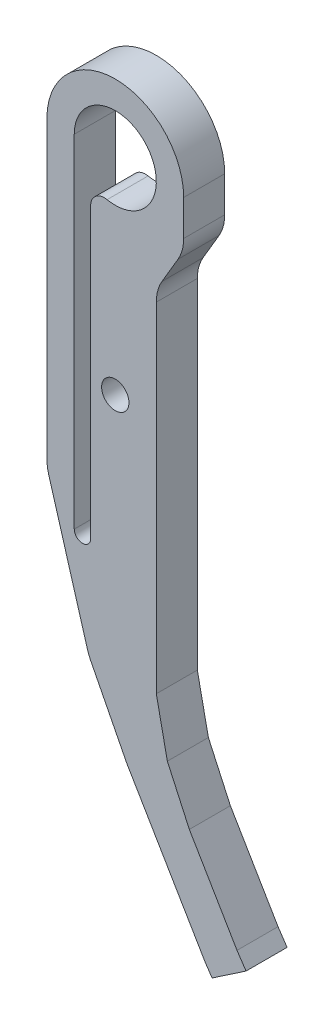
ISO-10303-21;
HEADER;
FILE_DESCRIPTION(('STEP AP214'),'2;1');
FILE_NAME('part.step','',(''),(''),'','','');
FILE_SCHEMA(('AUTOMOTIVE_DESIGN { 1 0 10303 214 1 1 1 1 }'));
ENDSEC;
DATA;
#1=APPLICATION_CONTEXT('core data for automotive mechanical design processes');
#2=APPLICATION_PROTOCOL_DEFINITION('international standard','automotive_design',2000,#1);
#3=PRODUCT_CONTEXT('',#1,'mechanical');
#4=PRODUCT('Part','Part','',(#3));
#5=PRODUCT_RELATED_PRODUCT_CATEGORY('part','',(#4));
#6=PRODUCT_DEFINITION_FORMATION('','',#4);
#7=PRODUCT_DEFINITION_CONTEXT('part definition',#1,'design');
#8=PRODUCT_DEFINITION('design','',#6,#7);
#9=PRODUCT_DEFINITION_SHAPE('','',#8);
#10=(LENGTH_UNIT() NAMED_UNIT(*) SI_UNIT(.MILLI.,.METRE.));
#11=(NAMED_UNIT(*) PLANE_ANGLE_UNIT() SI_UNIT($,.RADIAN.));
#12=(NAMED_UNIT(*) SI_UNIT($,.STERADIAN.) SOLID_ANGLE_UNIT());
#13=UNCERTAINTY_MEASURE_WITH_UNIT(LENGTH_MEASURE(1.E-05),#10,'distance_accuracy_value','');
#14=(GEOMETRIC_REPRESENTATION_CONTEXT(3) GLOBAL_UNCERTAINTY_ASSIGNED_CONTEXT((#13)) GLOBAL_UNIT_ASSIGNED_CONTEXT((#10,
#11,#12)) REPRESENTATION_CONTEXT('',''));
#15=CARTESIAN_POINT('',(0.,0.,0.));
#16=DIRECTION('',(0.,0.,1.));
#17=DIRECTION('',(1.,0.,0.));
#18=AXIS2_PLACEMENT_3D('',#15,#16,#17);
#19=CARTESIAN_POINT('',(0.,0.,3.));
#20=DIRECTION('',(0.,0.,1.));
#21=DIRECTION('',(1.,0.,0.));
#22=AXIS2_PLACEMENT_3D('',#19,#20,#21);
#23=PLANE('',#22);
#24=CARTESIAN_POINT('',(0.,0.,3.));
#25=DIRECTION('',(0.,0.,1.));
#26=DIRECTION('',(1.,0.,0.));
#27=AXIS2_PLACEMENT_3D('',#24,#25,#26);
#28=CIRCLE('',#27,4.99999999999989);
#29=CARTESIAN_POINT('',(4.99999999999989,0.,3.));
#30=VERTEX_POINT('',#29);
#31=CARTESIAN_POINT('',(-4.99999999999989,0.,3.));
#32=VERTEX_POINT('',#31);
#33=EDGE_CURVE('E246',#30,#32,#28,.T.);
#34=ORIENTED_EDGE('',*,*,#33,.T.);
#35=DIRECTION('',(0.,-1.,0.));
#36=VECTOR('',#35,1.);
#37=CARTESIAN_POINT('',(-4.99999999999989,-21.5350638762466,3.));
#38=LINE('',#37,#36);
#39=CARTESIAN_POINT('',(-5.00000000000001,-21.5350638762466,3.));
#40=VERTEX_POINT('',#39);
#41=EDGE_CURVE('E249',#32,#40,#38,.T.);
#42=ORIENTED_EDGE('',*,*,#41,.T.);
#43=CARTESIAN_POINT('',(-1.50000000000006,-21.5350638762466,3.));
#44=DIRECTION('',(0.,0.,1.));
#45=DIRECTION('',(1.,0.,0.));
#46=AXIS2_PLACEMENT_3D('',#43,#44,#45);
#47=CIRCLE('',#46,3.49999999999995);
#48=CARTESIAN_POINT('',(-4.8579069316852,-22.5222118074815,3.));
#49=VERTEX_POINT('',#48);
#50=EDGE_CURVE('E252',#40,#49,#47,.T.);
#51=ORIENTED_EDGE('',*,*,#50,.T.);
#52=DIRECTION('',(0.282042266067126,-0.959401980481446,0.));
#53=VECTOR('',#52,1.);
#54=CARTESIAN_POINT('',(-2.03270186247329,-32.1324995720218,3.));
#55=LINE('',#54,#53);
#56=CARTESIAN_POINT('',(-2.03270186247341,-32.1324995720218,3.));
#57=VERTEX_POINT('',#56);
#58=EDGE_CURVE('E254',#49,#57,#55,.T.);
#59=ORIENTED_EDGE('',*,*,#58,.T.);
#60=CARTESIAN_POINT('',(1.32520506921185,-31.1453516407869,3.));
#61=DIRECTION('',(0.,0.,1.));
#62=DIRECTION('',(1.,0.,0.));
#63=AXIS2_PLACEMENT_3D('',#60,#61,#62);
#64=CIRCLE('',#63,3.50000000000019);
#65=CARTESIAN_POINT('',(-1.79409652727758,-32.7327890569205,3.));
#66=VERTEX_POINT('',#65);
#67=EDGE_CURVE('E256',#57,#66,#64,.T.);
#68=ORIENTED_EDGE('',*,*,#67,.T.);
#69=DIRECTION('',(0.453553547466907,-0.891229027568214,0.));
#70=VECTOR('',#69,1.);
#71=CARTESIAN_POINT('',(0.79125555035775,-37.8129848374209,3.));
#72=LINE('',#71,#70);
#73=CARTESIAN_POINT('',(0.791255550357943,-37.8129848374208,3.));
#74=VERTEX_POINT('',#73);
#75=EDGE_CURVE('E258',#66,#74,#72,.T.);
#76=ORIENTED_EDGE('',*,*,#75,.T.);
#77=CARTESIAN_POINT('',(3.4649426330625,-36.4523241950203,3.));
#78=DIRECTION('',(0.,0.,1.));
#79=DIRECTION('',(1.,0.,0.));
#80=AXIS2_PLACEMENT_3D('',#77,#78,#79);
#81=CIRCLE('',#80,2.99999999999985);
#82=CARTESIAN_POINT('',(0.880089763503982,-37.9749980414933,3.));
#83=VERTEX_POINT('',#82);
#84=EDGE_CURVE('E260',#74,#83,#81,.T.);
#85=ORIENTED_EDGE('',*,*,#84,.T.);
#86=DIRECTION('',(0.50755794882443,-0.861617623186259,0.));
#87=VECTOR('',#86,1.);
#88=CARTESIAN_POINT('',(6.56573456522638,-47.626805823615,3.));
#89=LINE('',#88,#87);
#90=CARTESIAN_POINT('',(6.56573456522638,-47.626805823615,3.));
#91=VERTEX_POINT('',#90);
#92=EDGE_CURVE('E262',#83,#91,#89,.T.);
#93=ORIENTED_EDGE('',*,*,#92,.T.);
#94=DIRECTION('',(0.560410760909652,-0.828214814560006,0.));
#95=VECTOR('',#94,1.);
#96=CARTESIAN_POINT('',(7.077963412532,-48.3838139850837,3.));
#97=LINE('',#96,#95);
#98=CARTESIAN_POINT('',(7.077963412532,-48.3838139850837,3.));
#99=VERTEX_POINT('',#98);
#100=EDGE_CURVE('E264',#91,#99,#97,.T.);
#101=ORIENTED_EDGE('',*,*,#100,.T.);
#102=DIRECTION('',(0.82821481455998,0.56041076090969,0.));
#103=VECTOR('',#102,1.);
#104=CARTESIAN_POINT('',(9.56260785621144,-46.702581702355,3.));
#105=LINE('',#104,#103);
#106=CARTESIAN_POINT('',(9.56260785621144,-46.702581702355,3.));
#107=VERTEX_POINT('',#106);
#108=EDGE_CURVE('E266',#99,#107,#105,.T.);
#109=ORIENTED_EDGE('',*,*,#108,.T.);
#110=DIRECTION('',(-0.560410760910036,0.828214814559746,0.));
#111=VECTOR('',#110,1.);
#112=CARTESIAN_POINT('',(8.89976186397353,-45.7229808295032,3.));
#113=LINE('',#112,#111);
#114=CARTESIAN_POINT('',(8.89976186397353,-45.7229808295032,3.));
#115=VERTEX_POINT('',#114);
#116=EDGE_CURVE('E268',#107,#115,#113,.T.);
#117=ORIENTED_EDGE('',*,*,#116,.T.);
#118=DIRECTION('',(-0.507557948824447,0.861617623186248,0.));
#119=VECTOR('',#118,1.);
#120=CARTESIAN_POINT('',(5.41514713044074,-39.8075863974385,3.));
#121=LINE('',#120,#119);
#122=CARTESIAN_POINT('',(5.41514713044074,-39.8075863974385,3.));
#123=VERTEX_POINT('',#122);
#124=EDGE_CURVE('E270',#115,#123,#121,.T.);
#125=ORIENTED_EDGE('',*,*,#124,.T.);
#126=DIRECTION('',(-0.415986559571773,0.909370761711437,0.));
#127=VECTOR('',#126,1.);
#128=CARTESIAN_POINT('',(3.80711010811592,-36.2923241414728,3.));
#129=LINE('',#128,#127);
#130=CARTESIAN_POINT('',(3.80711010811592,-36.2923241414728,3.));
#131=VERTEX_POINT('',#130);
#132=EDGE_CURVE('E272',#123,#131,#129,.T.);
#133=ORIENTED_EDGE('',*,*,#132,.T.);
#134=DIRECTION('',(-0.204414432860834,0.978884436303992,0.));
#135=VECTOR('',#134,1.);
#136=CARTESIAN_POINT('',(2.99999999999952,-32.4272960602283,3.));
#137=LINE('',#136,#135);
#138=CARTESIAN_POINT('',(2.99999999999952,-32.4272960602283,3.));
#139=VERTEX_POINT('',#138);
#140=EDGE_CURVE('E274',#131,#139,#137,.T.);
#141=ORIENTED_EDGE('',*,*,#140,.T.);
#142=DIRECTION('',(0.,1.,0.));
#143=VECTOR('',#142,1.);
#144=CARTESIAN_POINT('',(2.99999999999952,-7.62938426557325,3.));
#145=LINE('',#144,#143);
#146=CARTESIAN_POINT('',(2.9999999999996,-7.62938426557325,3.));
#147=VERTEX_POINT('',#146);
#148=EDGE_CURVE('E276',#139,#147,#145,.T.);
#149=ORIENTED_EDGE('',*,*,#148,.T.);
#150=CARTESIAN_POINT('',(5.99999999999978,-7.62938426557325,3.));
#151=DIRECTION('',(0.,0.,-1.));
#152=DIRECTION('',(1.,0.,0.));
#153=AXIS2_PLACEMENT_3D('',#150,#151,#152);
#154=CIRCLE('',#153,3.00000000000018);
#155=CARTESIAN_POINT('',(3.41520528906081,-6.10661169479898,3.));
#156=VERTEX_POINT('',#155);
#157=EDGE_CURVE('E278',#147,#156,#154,.T.);
#158=ORIENTED_EDGE('',*,*,#157,.T.);
#159=DIRECTION('',(0.507590856924762,0.861598236979618,0.));
#160=VECTOR('',#159,1.);
#161=CARTESIAN_POINT('',(4.58479471093876,-4.12131946557071,3.));
#162=LINE('',#161,#160);
#163=CARTESIAN_POINT('',(4.58479471093867,-4.12131946557065,3.));
#164=VERTEX_POINT('',#163);
#165=EDGE_CURVE('E280',#156,#164,#162,.T.);
#166=ORIENTED_EDGE('',*,*,#165,.T.);
#167=CARTESIAN_POINT('',(1.99999999999978,-2.59854689479599,3.));
#168=DIRECTION('',(0.,0.,1.));
#169=DIRECTION('',(1.,0.,0.));
#170=AXIS2_PLACEMENT_3D('',#167,#168,#169);
#171=CIRCLE('',#170,3.00000000000022);
#172=CARTESIAN_POINT('',(4.99999999999989,-2.59854689479599,3.));
#173=VERTEX_POINT('',#172);
#174=EDGE_CURVE('E282',#164,#173,#171,.T.);
#175=ORIENTED_EDGE('',*,*,#174,.T.);
#176=DIRECTION('',(0.,1.,0.));
#177=VECTOR('',#176,1.);
#178=CARTESIAN_POINT('',(4.99999999999989,0.,3.));
#179=LINE('',#178,#177);
#180=EDGE_CURVE('E284',#173,#30,#179,.T.);
#181=ORIENTED_EDGE('',*,*,#180,.T.);
#182=EDGE_LOOP('',(#34,#42,#51,#59,#68,#76,#85,#93,#101,#109,#117,#125,#133,#141,#149,#158,#166,
#175,#181));
#183=FACE_BOUND('',#182,.T.);
#184=CARTESIAN_POINT('',(0.,-14.9999999999968,3.));
#185=DIRECTION('',(0.,0.,1.));
#186=DIRECTION('',(1.,0.,0.));
#187=AXIS2_PLACEMENT_3D('',#184,#185,#186);
#188=CIRCLE('',#187,0.99999999999989);
#189=CARTESIAN_POINT('',(0.99999999999989,-14.9999999999968,3.));
#190=VERTEX_POINT('',#189);
#191=EDGE_CURVE('E240',#190,#190,#188,.T.);
#192=ORIENTED_EDGE('',*,*,#191,.F.);
#193=EDGE_LOOP('',(#192));
#194=FACE_BOUND('',#193,.T.);
#195=CARTESIAN_POINT('',(0.,0.,3.));
#196=DIRECTION('',(0.,0.,1.));
#197=DIRECTION('',(1.,0.,0.));
#198=AXIS2_PLACEMENT_3D('',#195,#196,#197);
#199=CIRCLE('',#198,3.00000000000007);
#200=CARTESIAN_POINT('',(-0.599999999999498,-2.93938769133999,3.));
#201=VERTEX_POINT('',#200);
#202=CARTESIAN_POINT('',(-3.00000000000007,0.,3.));
#203=VERTEX_POINT('',#202);
#204=EDGE_CURVE('E204',#201,#203,#199,.T.);
#205=ORIENTED_EDGE('',*,*,#204,.F.);
#206=CARTESIAN_POINT('',(-0.800000000000356,-3.91918358845311,3.));
#207=DIRECTION('',(0.,0.,-1.));
#208=DIRECTION('',(1.,0.,0.));
#209=AXIS2_PLACEMENT_3D('',#206,#207,#208);
#210=CIRCLE('',#209,0.99999999999998);
#211=CARTESIAN_POINT('',(-1.80000000000025,-3.91918358845311,3.));
#212=VERTEX_POINT('',#211);
#213=EDGE_CURVE('E196',#212,#201,#210,.T.);
#214=ORIENTED_EDGE('',*,*,#213,.F.);
#215=DIRECTION('',(0.,1.,0.));
#216=VECTOR('',#215,1.);
#217=CARTESIAN_POINT('',(-1.80000000000025,-3.91918358845311,3.));
#218=LINE('',#217,#216);
#219=CARTESIAN_POINT('',(-1.80000000000025,-24.9999999999999,3.));
#220=VERTEX_POINT('',#219);
#221=EDGE_CURVE('E223',#220,#212,#218,.T.);
#222=ORIENTED_EDGE('',*,*,#221,.F.);
#223=CARTESIAN_POINT('',(-2.40000000000018,-24.9999999999999,3.));
#224=DIRECTION('',(0.,0.,1.));
#225=DIRECTION('',(1.,0.,0.));
#226=AXIS2_PLACEMENT_3D('',#223,#224,#225);
#227=CIRCLE('',#226,0.599999999999934);
#228=CARTESIAN_POINT('',(-3.00000000000011,-24.9999999999999,3.));
#229=VERTEX_POINT('',#228);
#230=EDGE_CURVE('E219',#229,#220,#227,.T.);
#231=ORIENTED_EDGE('',*,*,#230,.F.);
#232=DIRECTION('',(0.,-1.,0.));
#233=VECTOR('',#232,1.);
#234=CARTESIAN_POINT('',(-3.00000000000011,-24.9999999999999,3.));
#235=LINE('',#234,#233);
#236=EDGE_CURVE('E217',#203,#229,#235,.T.);
#237=ORIENTED_EDGE('',*,*,#236,.F.);
#238=EDGE_LOOP('',(#205,#214,#222,#231,#237));
#239=FACE_BOUND('',#238,.T.);
#240=ADVANCED_FACE('F35',(#183,#194,#239),#23,.T.);
#241=CARTESIAN_POINT('',(0.,0.,0.));
#242=DIRECTION('',(0.,0.,1.));
#243=DIRECTION('',(1.,0.,0.));
#244=AXIS2_PLACEMENT_3D('',#241,#242,#243);
#245=PLANE('',#244);
#246=CARTESIAN_POINT('',(0.,-14.9999999999968,0.));
#247=DIRECTION('',(0.,0.,1.));
#248=DIRECTION('',(1.,0.,0.));
#249=AXIS2_PLACEMENT_3D('',#246,#247,#248);
#250=CIRCLE('',#249,0.99999999999989);
#251=CARTESIAN_POINT('',(0.99999999999989,-14.9999999999968,0.));
#252=VERTEX_POINT('',#251);
#253=EDGE_CURVE('E212',#252,#252,#250,.T.);
#254=ORIENTED_EDGE('',*,*,#253,.T.);
#255=EDGE_LOOP('',(#254));
#256=FACE_BOUND('',#255,.T.);
#257=CARTESIAN_POINT('',(0.,0.,0.));
#258=DIRECTION('',(0.,0.,1.));
#259=DIRECTION('',(1.,0.,0.));
#260=AXIS2_PLACEMENT_3D('',#257,#258,#259);
#261=CIRCLE('',#260,4.99999999999989);
#262=CARTESIAN_POINT('',(4.99999999999989,0.,0.));
#263=VERTEX_POINT('',#262);
#264=CARTESIAN_POINT('',(-4.99999999999989,0.,0.));
#265=VERTEX_POINT('',#264);
#266=EDGE_CURVE('E243',#263,#265,#261,.T.);
#267=ORIENTED_EDGE('',*,*,#266,.F.);
#268=DIRECTION('',(0.,1.,0.));
#269=VECTOR('',#268,1.);
#270=CARTESIAN_POINT('',(4.99999999999989,0.,0.));
#271=LINE('',#270,#269);
#272=CARTESIAN_POINT('',(4.99999999999989,-2.59854689479599,0.));
#273=VERTEX_POINT('',#272);
#274=EDGE_CURVE('E250',#273,#263,#271,.T.);
#275=ORIENTED_EDGE('',*,*,#274,.F.);
#276=CARTESIAN_POINT('',(1.99999999999978,-2.59854689479599,0.));
#277=DIRECTION('',(0.,0.,1.));
#278=DIRECTION('',(1.,0.,0.));
#279=AXIS2_PLACEMENT_3D('',#276,#277,#278);
#280=CIRCLE('',#279,3.00000000000022);
#281=CARTESIAN_POINT('',(4.58479471093867,-4.12131946557065,0.));
#282=VERTEX_POINT('',#281);
#283=EDGE_CURVE('E321',#282,#273,#280,.T.);
#284=ORIENTED_EDGE('',*,*,#283,.F.);
#285=DIRECTION('',(0.507590856924762,0.861598236979618,0.));
#286=VECTOR('',#285,1.);
#287=CARTESIAN_POINT('',(4.58479471093876,-4.12131946557071,0.));
#288=LINE('',#287,#286);
#289=CARTESIAN_POINT('',(3.41520528906081,-6.10661169479898,0.));
#290=VERTEX_POINT('',#289);
#291=EDGE_CURVE('E319',#290,#282,#288,.T.);
#292=ORIENTED_EDGE('',*,*,#291,.F.);
#293=CARTESIAN_POINT('',(5.99999999999978,-7.62938426557325,0.));
#294=DIRECTION('',(0.,0.,-1.));
#295=DIRECTION('',(1.,0.,0.));
#296=AXIS2_PLACEMENT_3D('',#293,#294,#295);
#297=CIRCLE('',#296,3.00000000000018);
#298=CARTESIAN_POINT('',(2.9999999999996,-7.62938426557325,0.));
#299=VERTEX_POINT('',#298);
#300=EDGE_CURVE('E317',#299,#290,#297,.T.);
#301=ORIENTED_EDGE('',*,*,#300,.F.);
#302=DIRECTION('',(0.,1.,0.));
#303=VECTOR('',#302,1.);
#304=CARTESIAN_POINT('',(2.99999999999952,-7.62938426557325,0.));
#305=LINE('',#304,#303);
#306=CARTESIAN_POINT('',(2.99999999999952,-32.4272960602283,0.));
#307=VERTEX_POINT('',#306);
#308=EDGE_CURVE('E315',#307,#299,#305,.T.);
#309=ORIENTED_EDGE('',*,*,#308,.F.);
#310=DIRECTION('',(-0.204414432860834,0.978884436303992,0.));
#311=VECTOR('',#310,1.);
#312=CARTESIAN_POINT('',(2.99999999999952,-32.4272960602283,0.));
#313=LINE('',#312,#311);
#314=CARTESIAN_POINT('',(3.80711010811592,-36.2923241414728,0.));
#315=VERTEX_POINT('',#314);
#316=EDGE_CURVE('E313',#315,#307,#313,.T.);
#317=ORIENTED_EDGE('',*,*,#316,.F.);
#318=DIRECTION('',(-0.415986559571773,0.909370761711437,0.));
#319=VECTOR('',#318,1.);
#320=CARTESIAN_POINT('',(3.80711010811592,-36.2923241414728,0.));
#321=LINE('',#320,#319);
#322=CARTESIAN_POINT('',(5.41514713044074,-39.8075863974385,0.));
#323=VERTEX_POINT('',#322);
#324=EDGE_CURVE('E311',#323,#315,#321,.T.);
#325=ORIENTED_EDGE('',*,*,#324,.F.);
#326=DIRECTION('',(-0.507557948824447,0.861617623186248,0.));
#327=VECTOR('',#326,1.);
#328=CARTESIAN_POINT('',(5.41514713044074,-39.8075863974385,0.));
#329=LINE('',#328,#327);
#330=CARTESIAN_POINT('',(8.89976186397353,-45.7229808295032,0.));
#331=VERTEX_POINT('',#330);
#332=EDGE_CURVE('E309',#331,#323,#329,.T.);
#333=ORIENTED_EDGE('',*,*,#332,.F.);
#334=DIRECTION('',(-0.560410760910036,0.828214814559746,0.));
#335=VECTOR('',#334,1.);
#336=CARTESIAN_POINT('',(8.89976186397353,-45.7229808295032,0.));
#337=LINE('',#336,#335);
#338=CARTESIAN_POINT('',(9.56260785621144,-46.702581702355,0.));
#339=VERTEX_POINT('',#338);
#340=EDGE_CURVE('E307',#339,#331,#337,.T.);
#341=ORIENTED_EDGE('',*,*,#340,.F.);
#342=DIRECTION('',(0.82821481455998,0.56041076090969,0.));
#343=VECTOR('',#342,1.);
#344=CARTESIAN_POINT('',(9.56260785621144,-46.702581702355,0.));
#345=LINE('',#344,#343);
#346=CARTESIAN_POINT('',(7.077963412532,-48.3838139850837,0.));
#347=VERTEX_POINT('',#346);
#348=EDGE_CURVE('E305',#347,#339,#345,.T.);
#349=ORIENTED_EDGE('',*,*,#348,.F.);
#350=DIRECTION('',(0.560410760909652,-0.828214814560006,0.));
#351=VECTOR('',#350,1.);
#352=CARTESIAN_POINT('',(7.077963412532,-48.3838139850837,0.));
#353=LINE('',#352,#351);
#354=CARTESIAN_POINT('',(6.56573456522638,-47.626805823615,0.));
#355=VERTEX_POINT('',#354);
#356=EDGE_CURVE('E303',#355,#347,#353,.T.);
#357=ORIENTED_EDGE('',*,*,#356,.F.);
#358=DIRECTION('',(0.50755794882443,-0.861617623186259,0.));
#359=VECTOR('',#358,1.);
#360=CARTESIAN_POINT('',(6.56573456522638,-47.626805823615,0.));
#361=LINE('',#360,#359);
#362=CARTESIAN_POINT('',(0.880089763503982,-37.9749980414933,0.));
#363=VERTEX_POINT('',#362);
#364=EDGE_CURVE('E301',#363,#355,#361,.T.);
#365=ORIENTED_EDGE('',*,*,#364,.F.);
#366=CARTESIAN_POINT('',(3.4649426330625,-36.4523241950203,0.));
#367=DIRECTION('',(0.,0.,1.));
#368=DIRECTION('',(1.,0.,0.));
#369=AXIS2_PLACEMENT_3D('',#366,#367,#368);
#370=CIRCLE('',#369,2.99999999999985);
#371=CARTESIAN_POINT('',(0.791255550357943,-37.8129848374208,0.));
#372=VERTEX_POINT('',#371);
#373=EDGE_CURVE('E299',#372,#363,#370,.T.);
#374=ORIENTED_EDGE('',*,*,#373,.F.);
#375=DIRECTION('',(0.453553547466907,-0.891229027568214,0.));
#376=VECTOR('',#375,1.);
#377=CARTESIAN_POINT('',(0.79125555035775,-37.8129848374209,0.));
#378=LINE('',#377,#376);
#379=CARTESIAN_POINT('',(-1.79409652727758,-32.7327890569205,0.));
#380=VERTEX_POINT('',#379);
#381=EDGE_CURVE('E297',#380,#372,#378,.T.);
#382=ORIENTED_EDGE('',*,*,#381,.F.);
#383=CARTESIAN_POINT('',(1.32520506921185,-31.1453516407869,0.));
#384=DIRECTION('',(0.,0.,1.));
#385=DIRECTION('',(1.,0.,0.));
#386=AXIS2_PLACEMENT_3D('',#383,#384,#385);
#387=CIRCLE('',#386,3.50000000000019);
#388=CARTESIAN_POINT('',(-2.03270186247341,-32.1324995720218,0.));
#389=VERTEX_POINT('',#388);
#390=EDGE_CURVE('E295',#389,#380,#387,.T.);
#391=ORIENTED_EDGE('',*,*,#390,.F.);
#392=DIRECTION('',(0.282042266067126,-0.959401980481446,0.));
#393=VECTOR('',#392,1.);
#394=CARTESIAN_POINT('',(-2.03270186247329,-32.1324995720218,0.));
#395=LINE('',#394,#393);
#396=CARTESIAN_POINT('',(-4.8579069316852,-22.5222118074815,0.));
#397=VERTEX_POINT('',#396);
#398=EDGE_CURVE('E293',#397,#389,#395,.T.);
#399=ORIENTED_EDGE('',*,*,#398,.F.);
#400=CARTESIAN_POINT('',(-1.50000000000006,-21.5350638762466,0.));
#401=DIRECTION('',(0.,0.,1.));
#402=DIRECTION('',(1.,0.,0.));
#403=AXIS2_PLACEMENT_3D('',#400,#401,#402);
#404=CIRCLE('',#403,3.49999999999995);
#405=CARTESIAN_POINT('',(-5.00000000000001,-21.5350638762466,0.));
#406=VERTEX_POINT('',#405);
#407=EDGE_CURVE('E291',#406,#397,#404,.T.);
#408=ORIENTED_EDGE('',*,*,#407,.F.);
#409=DIRECTION('',(0.,-1.,0.));
#410=VECTOR('',#409,1.);
#411=CARTESIAN_POINT('',(-4.99999999999989,-21.5350638762466,0.));
#412=LINE('',#411,#410);
#413=EDGE_CURVE('E289',#265,#406,#412,.T.);
#414=ORIENTED_EDGE('',*,*,#413,.F.);
#415=EDGE_LOOP('',(#267,#275,#284,#292,#301,#309,#317,#325,#333,#341,#349,#357,#365,#374,#382,
#391,#399,#408,#414));
#416=FACE_BOUND('',#415,.T.);
#417=CARTESIAN_POINT('',(-0.800000000000356,-3.91918358845311,0.));
#418=DIRECTION('',(0.,0.,-1.));
#419=DIRECTION('',(1.,0.,0.));
#420=AXIS2_PLACEMENT_3D('',#417,#418,#419);
#421=CIRCLE('',#420,0.99999999999998);
#422=CARTESIAN_POINT('',(-1.80000000000025,-3.91918358845311,0.));
#423=VERTEX_POINT('',#422);
#424=CARTESIAN_POINT('',(-0.599999999999498,-2.93938769133999,0.));
#425=VERTEX_POINT('',#424);
#426=EDGE_CURVE('E58',#423,#425,#421,.T.);
#427=ORIENTED_EDGE('',*,*,#426,.T.);
#428=CARTESIAN_POINT('',(0.,0.,0.));
#429=DIRECTION('',(0.,0.,1.));
#430=DIRECTION('',(1.,0.,0.));
#431=AXIS2_PLACEMENT_3D('',#428,#429,#430);
#432=CIRCLE('',#431,3.00000000000007);
#433=CARTESIAN_POINT('',(-3.00000000000007,0.,0.));
#434=VERTEX_POINT('',#433);
#435=EDGE_CURVE('E211',#425,#434,#432,.T.);
#436=ORIENTED_EDGE('',*,*,#435,.T.);
#437=DIRECTION('',(0.,-1.,0.));
#438=VECTOR('',#437,1.);
#439=CARTESIAN_POINT('',(-3.00000000000011,-24.9999999999999,0.));
#440=LINE('',#439,#438);
#441=CARTESIAN_POINT('',(-3.00000000000011,-24.9999999999999,0.));
#442=VERTEX_POINT('',#441);
#443=EDGE_CURVE('E227',#434,#442,#440,.T.);
#444=ORIENTED_EDGE('',*,*,#443,.T.);
#445=CARTESIAN_POINT('',(-2.40000000000018,-24.9999999999999,0.));
#446=DIRECTION('',(0.,0.,1.));
#447=DIRECTION('',(1.,0.,0.));
#448=AXIS2_PLACEMENT_3D('',#445,#446,#447);
#449=CIRCLE('',#448,0.599999999999934);
#450=CARTESIAN_POINT('',(-1.80000000000025,-24.9999999999999,0.));
#451=VERTEX_POINT('',#450);
#452=EDGE_CURVE('E230',#442,#451,#449,.T.);
#453=ORIENTED_EDGE('',*,*,#452,.T.);
#454=DIRECTION('',(0.,1.,0.));
#455=VECTOR('',#454,1.);
#456=CARTESIAN_POINT('',(-1.80000000000025,-3.91918358845311,0.));
#457=LINE('',#456,#455);
#458=EDGE_CURVE('E205',#451,#423,#457,.T.);
#459=ORIENTED_EDGE('',*,*,#458,.T.);
#460=EDGE_LOOP('',(#427,#436,#444,#453,#459));
#461=FACE_BOUND('',#460,.T.);
#462=ADVANCED_FACE('F384',(#256,#416,#461),#245,.F.);
#463=CARTESIAN_POINT('',(0.,0.,3.));
#464=DIRECTION('',(0.,0.,-1.));
#465=DIRECTION('',(-1.,0.,0.));
#466=AXIS2_PLACEMENT_3D('',#463,#464,#465);
#467=CYLINDRICAL_SURFACE('',#466,4.99999999999989);
#468=ORIENTED_EDGE('',*,*,#266,.T.);
#469=DIRECTION('',(0.,0.,-1.));
#470=VECTOR('',#469,1.);
#471=CARTESIAN_POINT('',(-4.99999999999989,0.,3.));
#472=LINE('',#471,#470);
#473=EDGE_CURVE('E11',#32,#265,#472,.T.);
#474=ORIENTED_EDGE('',*,*,#473,.F.);
#475=ORIENTED_EDGE('',*,*,#33,.F.);
#476=DIRECTION('',(0.,0.,-1.));
#477=VECTOR('',#476,1.);
#478=CARTESIAN_POINT('',(4.99999999999989,0.,3.));
#479=LINE('',#478,#477);
#480=EDGE_CURVE('E286',#30,#263,#479,.T.);
#481=ORIENTED_EDGE('',*,*,#480,.T.);
#482=EDGE_LOOP('',(#468,#474,#475,#481));
#483=FACE_BOUND('',#482,.T.);
#484=ADVANCED_FACE('F37',(#483),#467,.T.);
#485=CARTESIAN_POINT('',(-4.99999999999989,-21.5350638762466,3.));
#486=DIRECTION('',(1.,0.,0.));
#487=DIRECTION('',(0.,0.,-1.));
#488=AXIS2_PLACEMENT_3D('',#485,#486,#487);
#489=PLANE('',#488);
#490=ORIENTED_EDGE('',*,*,#413,.T.);
#491=DIRECTION('',(0.,0.,-1.));
#492=VECTOR('',#491,1.);
#493=CARTESIAN_POINT('',(-5.00000000000001,-21.5350638762466,3.));
#494=LINE('',#493,#492);
#495=EDGE_CURVE('E43',#40,#406,#494,.T.);
#496=ORIENTED_EDGE('',*,*,#495,.F.);
#497=ORIENTED_EDGE('',*,*,#41,.F.);
#498=ORIENTED_EDGE('',*,*,#473,.T.);
#499=EDGE_LOOP('',(#490,#496,#497,#498));
#500=FACE_BOUND('',#499,.T.);
#501=ADVANCED_FACE('F402',(#500),#489,.F.);
#502=CARTESIAN_POINT('',(-1.50000000000006,-21.5350638762466,3.));
#503=DIRECTION('',(0.,0.,-1.));
#504=DIRECTION('',(-1.,0.,0.));
#505=AXIS2_PLACEMENT_3D('',#502,#503,#504);
#506=CYLINDRICAL_SURFACE('',#505,3.49999999999995);
#507=ORIENTED_EDGE('',*,*,#407,.T.);
#508=DIRECTION('',(0.,0.,-1.));
#509=VECTOR('',#508,1.);
#510=CARTESIAN_POINT('',(-4.8579069316852,-22.5222118074815,3.));
#511=LINE('',#510,#509);
#512=EDGE_CURVE('E371',#49,#397,#511,.T.);
#513=ORIENTED_EDGE('',*,*,#512,.F.);
#514=ORIENTED_EDGE('',*,*,#50,.F.);
#515=ORIENTED_EDGE('',*,*,#495,.T.);
#516=EDGE_LOOP('',(#507,#513,#514,#515));
#517=FACE_BOUND('',#516,.T.);
#518=ADVANCED_FACE('F378',(#517),#506,.T.);
#519=CARTESIAN_POINT('',(-2.03270186247329,-32.1324995720218,3.));
#520=DIRECTION('',(0.959401980481446,0.282042266067126,0.));
#521=DIRECTION('',(-0.282042266067126,0.959401980481446,0.));
#522=AXIS2_PLACEMENT_3D('',#519,#520,#521);
#523=PLANE('',#522);
#524=ORIENTED_EDGE('',*,*,#398,.T.);
#525=DIRECTION('',(0.,0.,-1.));
#526=VECTOR('',#525,1.);
#527=CARTESIAN_POINT('',(-2.03270186247341,-32.1324995720218,3.));
#528=LINE('',#527,#526);
#529=EDGE_CURVE('E368',#57,#389,#528,.T.);
#530=ORIENTED_EDGE('',*,*,#529,.F.);
#531=ORIENTED_EDGE('',*,*,#58,.F.);
#532=ORIENTED_EDGE('',*,*,#512,.T.);
#533=EDGE_LOOP('',(#524,#530,#531,#532));
#534=FACE_BOUND('',#533,.T.);
#535=ADVANCED_FACE('F390',(#534),#523,.F.);
#536=CARTESIAN_POINT('',(1.32520506921185,-31.1453516407869,3.));
#537=DIRECTION('',(0.,0.,-1.));
#538=DIRECTION('',(-1.,0.,0.));
#539=AXIS2_PLACEMENT_3D('',#536,#537,#538);
#540=CYLINDRICAL_SURFACE('',#539,3.50000000000019);
#541=ORIENTED_EDGE('',*,*,#390,.T.);
#542=DIRECTION('',(0.,0.,-1.));
#543=VECTOR('',#542,1.);
#544=CARTESIAN_POINT('',(-1.79409652727758,-32.7327890569205,3.));
#545=LINE('',#544,#543);
#546=EDGE_CURVE('E365',#66,#380,#545,.T.);
#547=ORIENTED_EDGE('',*,*,#546,.F.);
#548=ORIENTED_EDGE('',*,*,#67,.F.);
#549=ORIENTED_EDGE('',*,*,#529,.T.);
#550=EDGE_LOOP('',(#541,#547,#548,#549));
#551=FACE_BOUND('',#550,.T.);
#552=ADVANCED_FACE('F394',(#551),#540,.T.);
#553=CARTESIAN_POINT('',(0.79125555035775,-37.8129848374209,3.));
#554=DIRECTION('',(0.891229027568214,0.453553547466907,0.));
#555=DIRECTION('',(-0.453553547466907,0.891229027568214,0.));
#556=AXIS2_PLACEMENT_3D('',#553,#554,#555);
#557=PLANE('',#556);
#558=ORIENTED_EDGE('',*,*,#381,.T.);
#559=DIRECTION('',(0.,0.,-1.));
#560=VECTOR('',#559,1.);
#561=CARTESIAN_POINT('',(0.791255550357943,-37.8129848374208,3.));
#562=LINE('',#561,#560);
#563=EDGE_CURVE('E362',#74,#372,#562,.T.);
#564=ORIENTED_EDGE('',*,*,#563,.F.);
#565=ORIENTED_EDGE('',*,*,#75,.F.);
#566=ORIENTED_EDGE('',*,*,#546,.T.);
#567=EDGE_LOOP('',(#558,#564,#565,#566));
#568=FACE_BOUND('',#567,.T.);
#569=ADVANCED_FACE('F470',(#568),#557,.F.);
#570=CARTESIAN_POINT('',(3.4649426330625,-36.4523241950203,3.));
#571=DIRECTION('',(0.,0.,-1.));
#572=DIRECTION('',(-1.,0.,0.));
#573=AXIS2_PLACEMENT_3D('',#570,#571,#572);
#574=CYLINDRICAL_SURFACE('',#573,2.99999999999985);
#575=ORIENTED_EDGE('',*,*,#373,.T.);
#576=DIRECTION('',(0.,0.,-1.));
#577=VECTOR('',#576,1.);
#578=CARTESIAN_POINT('',(0.880089763503982,-37.9749980414933,3.));
#579=LINE('',#578,#577);
#580=EDGE_CURVE('E359',#83,#363,#579,.T.);
#581=ORIENTED_EDGE('',*,*,#580,.F.);
#582=ORIENTED_EDGE('',*,*,#84,.F.);
#583=ORIENTED_EDGE('',*,*,#563,.T.);
#584=EDGE_LOOP('',(#575,#581,#582,#583));
#585=FACE_BOUND('',#584,.T.);
#586=ADVANCED_FACE('F467',(#585),#574,.T.);
#587=CARTESIAN_POINT('',(6.56573456522638,-47.626805823615,3.));
#588=DIRECTION('',(0.861617623186259,0.50755794882443,0.));
#589=DIRECTION('',(-0.50755794882443,0.861617623186259,0.));
#590=AXIS2_PLACEMENT_3D('',#587,#588,#589);
#591=PLANE('',#590);
#592=ORIENTED_EDGE('',*,*,#364,.T.);
#593=DIRECTION('',(0.,0.,-1.));
#594=VECTOR('',#593,1.);
#595=CARTESIAN_POINT('',(6.56573456522638,-47.626805823615,3.));
#596=LINE('',#595,#594);
#597=EDGE_CURVE('E356',#91,#355,#596,.T.);
#598=ORIENTED_EDGE('',*,*,#597,.F.);
#599=ORIENTED_EDGE('',*,*,#92,.F.);
#600=ORIENTED_EDGE('',*,*,#580,.T.);
#601=EDGE_LOOP('',(#592,#598,#599,#600));
#602=FACE_BOUND('',#601,.T.);
#603=ADVANCED_FACE('F463',(#602),#591,.F.);
#604=CARTESIAN_POINT('',(7.077963412532,-48.3838139850837,3.));
#605=DIRECTION('',(0.828214814560006,0.560410760909652,0.));
#606=DIRECTION('',(-0.560410760909652,0.828214814560006,0.));
#607=AXIS2_PLACEMENT_3D('',#604,#605,#606);
#608=PLANE('',#607);
#609=ORIENTED_EDGE('',*,*,#356,.T.);
#610=DIRECTION('',(0.,0.,-1.));
#611=VECTOR('',#610,1.);
#612=CARTESIAN_POINT('',(7.077963412532,-48.3838139850837,3.));
#613=LINE('',#612,#611);
#614=EDGE_CURVE('E353',#99,#347,#613,.T.);
#615=ORIENTED_EDGE('',*,*,#614,.F.);
#616=ORIENTED_EDGE('',*,*,#100,.F.);
#617=ORIENTED_EDGE('',*,*,#597,.T.);
#618=EDGE_LOOP('',(#609,#615,#616,#617));
#619=FACE_BOUND('',#618,.T.);
#620=ADVANCED_FACE('F459',(#619),#608,.F.);
#621=CARTESIAN_POINT('',(9.56260785621144,-46.702581702355,3.));
#622=DIRECTION('',(-0.56041076090969,0.82821481455998,0.));
#623=DIRECTION('',(-0.82821481455998,-0.56041076090969,0.));
#624=AXIS2_PLACEMENT_3D('',#621,#622,#623);
#625=PLANE('',#624);
#626=ORIENTED_EDGE('',*,*,#348,.T.);
#627=DIRECTION('',(0.,0.,-1.));
#628=VECTOR('',#627,1.);
#629=CARTESIAN_POINT('',(9.56260785621144,-46.702581702355,3.));
#630=LINE('',#629,#628);
#631=EDGE_CURVE('E350',#107,#339,#630,.T.);
#632=ORIENTED_EDGE('',*,*,#631,.F.);
#633=ORIENTED_EDGE('',*,*,#108,.F.);
#634=ORIENTED_EDGE('',*,*,#614,.T.);
#635=EDGE_LOOP('',(#626,#632,#633,#634));
#636=FACE_BOUND('',#635,.T.);
#637=ADVANCED_FACE('F454',(#636),#625,.F.);
#638=CARTESIAN_POINT('',(8.89976186397353,-45.7229808295032,3.));
#639=DIRECTION('',(-0.828214814559746,-0.560410760910036,0.));
#640=DIRECTION('',(0.560410760910036,-0.828214814559746,0.));
#641=AXIS2_PLACEMENT_3D('',#638,#639,#640);
#642=PLANE('',#641);
#643=ORIENTED_EDGE('',*,*,#340,.T.);
#644=DIRECTION('',(0.,0.,-1.));
#645=VECTOR('',#644,1.);
#646=CARTESIAN_POINT('',(8.89976186397353,-45.7229808295032,3.));
#647=LINE('',#646,#645);
#648=EDGE_CURVE('E347',#115,#331,#647,.T.);
#649=ORIENTED_EDGE('',*,*,#648,.F.);
#650=ORIENTED_EDGE('',*,*,#116,.F.);
#651=ORIENTED_EDGE('',*,*,#631,.T.);
#652=EDGE_LOOP('',(#643,#649,#650,#651));
#653=FACE_BOUND('',#652,.T.);
#654=ADVANCED_FACE('F448',(#653),#642,.F.);
#655=CARTESIAN_POINT('',(5.41514713044074,-39.8075863974385,3.));
#656=DIRECTION('',(-0.861617623186248,-0.507557948824447,0.));
#657=DIRECTION('',(0.507557948824447,-0.861617623186248,0.));
#658=AXIS2_PLACEMENT_3D('',#655,#656,#657);
#659=PLANE('',#658);
#660=ORIENTED_EDGE('',*,*,#332,.T.);
#661=DIRECTION('',(0.,0.,-1.));
#662=VECTOR('',#661,1.);
#663=CARTESIAN_POINT('',(5.41514713044074,-39.8075863974385,3.));
#664=LINE('',#663,#662);
#665=EDGE_CURVE('E344',#123,#323,#664,.T.);
#666=ORIENTED_EDGE('',*,*,#665,.F.);
#667=ORIENTED_EDGE('',*,*,#124,.F.);
#668=ORIENTED_EDGE('',*,*,#648,.T.);
#669=EDGE_LOOP('',(#660,#666,#667,#668));
#670=FACE_BOUND('',#669,.T.);
#671=ADVANCED_FACE('F444',(#670),#659,.F.);
#672=CARTESIAN_POINT('',(3.80711010811592,-36.2923241414728,3.));
#673=DIRECTION('',(-0.909370761711437,-0.415986559571773,0.));
#674=DIRECTION('',(0.415986559571773,-0.909370761711437,0.));
#675=AXIS2_PLACEMENT_3D('',#672,#673,#674);
#676=PLANE('',#675);
#677=ORIENTED_EDGE('',*,*,#324,.T.);
#678=DIRECTION('',(0.,0.,-1.));
#679=VECTOR('',#678,1.);
#680=CARTESIAN_POINT('',(3.80711010811592,-36.2923241414728,3.));
#681=LINE('',#680,#679);
#682=EDGE_CURVE('E341',#131,#315,#681,.T.);
#683=ORIENTED_EDGE('',*,*,#682,.F.);
#684=ORIENTED_EDGE('',*,*,#132,.F.);
#685=ORIENTED_EDGE('',*,*,#665,.T.);
#686=EDGE_LOOP('',(#677,#683,#684,#685));
#687=FACE_BOUND('',#686,.T.);
#688=ADVANCED_FACE('F439',(#687),#676,.F.);
#689=CARTESIAN_POINT('',(2.99999999999952,-32.4272960602283,3.));
#690=DIRECTION('',(-0.978884436303992,-0.204414432860834,0.));
#691=DIRECTION('',(0.204414432860834,-0.978884436303992,0.));
#692=AXIS2_PLACEMENT_3D('',#689,#690,#691);
#693=PLANE('',#692);
#694=ORIENTED_EDGE('',*,*,#316,.T.);
#695=DIRECTION('',(0.,0.,-1.));
#696=VECTOR('',#695,1.);
#697=CARTESIAN_POINT('',(2.99999999999952,-32.4272960602283,3.));
#698=LINE('',#697,#696);
#699=EDGE_CURVE('E338',#139,#307,#698,.T.);
#700=ORIENTED_EDGE('',*,*,#699,.F.);
#701=ORIENTED_EDGE('',*,*,#140,.F.);
#702=ORIENTED_EDGE('',*,*,#682,.T.);
#703=EDGE_LOOP('',(#694,#700,#701,#702));
#704=FACE_BOUND('',#703,.T.);
#705=ADVANCED_FACE('F433',(#704),#693,.F.);
#706=CARTESIAN_POINT('',(2.99999999999952,-7.62938426557325,3.));
#707=DIRECTION('',(-1.,0.,0.));
#708=DIRECTION('',(0.,0.,1.));
#709=AXIS2_PLACEMENT_3D('',#706,#707,#708);
#710=PLANE('',#709);
#711=ORIENTED_EDGE('',*,*,#308,.T.);
#712=DIRECTION('',(0.,0.,-1.));
#713=VECTOR('',#712,1.);
#714=CARTESIAN_POINT('',(2.9999999999996,-7.62938426557325,3.));
#715=LINE('',#714,#713);
#716=EDGE_CURVE('E335',#147,#299,#715,.T.);
#717=ORIENTED_EDGE('',*,*,#716,.F.);
#718=ORIENTED_EDGE('',*,*,#148,.F.);
#719=ORIENTED_EDGE('',*,*,#699,.T.);
#720=EDGE_LOOP('',(#711,#717,#718,#719));
#721=FACE_BOUND('',#720,.T.);
#722=ADVANCED_FACE('F429',(#721),#710,.F.);
#723=CARTESIAN_POINT('',(5.99999999999978,-7.62938426557325,3.));
#724=DIRECTION('',(0.,0.,-1.));
#725=DIRECTION('',(-1.,0.,0.));
#726=AXIS2_PLACEMENT_3D('',#723,#724,#725);
#727=CYLINDRICAL_SURFACE('',#726,3.00000000000018);
#728=ORIENTED_EDGE('',*,*,#300,.T.);
#729=DIRECTION('',(0.,0.,-1.));
#730=VECTOR('',#729,1.);
#731=CARTESIAN_POINT('',(3.41520528906081,-6.10661169479898,3.));
#732=LINE('',#731,#730);
#733=EDGE_CURVE('E332',#156,#290,#732,.T.);
#734=ORIENTED_EDGE('',*,*,#733,.F.);
#735=ORIENTED_EDGE('',*,*,#157,.F.);
#736=ORIENTED_EDGE('',*,*,#716,.T.);
#737=EDGE_LOOP('',(#728,#734,#735,#736));
#738=FACE_BOUND('',#737,.T.);
#739=ADVANCED_FACE('F424',(#738),#727,.F.);
#740=CARTESIAN_POINT('',(4.58479471093876,-4.12131946557071,3.));
#741=DIRECTION('',(-0.861598236979618,0.507590856924762,0.));
#742=DIRECTION('',(-0.507590856924762,-0.861598236979618,0.));
#743=AXIS2_PLACEMENT_3D('',#740,#741,#742);
#744=PLANE('',#743);
#745=ORIENTED_EDGE('',*,*,#291,.T.);
#746=DIRECTION('',(0.,0.,-1.));
#747=VECTOR('',#746,1.);
#748=CARTESIAN_POINT('',(4.58479471093867,-4.12131946557065,3.));
#749=LINE('',#748,#747);
#750=EDGE_CURVE('E329',#164,#282,#749,.T.);
#751=ORIENTED_EDGE('',*,*,#750,.F.);
#752=ORIENTED_EDGE('',*,*,#165,.F.);
#753=ORIENTED_EDGE('',*,*,#733,.T.);
#754=EDGE_LOOP('',(#745,#751,#752,#753));
#755=FACE_BOUND('',#754,.T.);
#756=ADVANCED_FACE('F418',(#755),#744,.F.);
#757=CARTESIAN_POINT('',(1.99999999999978,-2.59854689479599,3.));
#758=DIRECTION('',(0.,0.,-1.));
#759=DIRECTION('',(-1.,0.,0.));
#760=AXIS2_PLACEMENT_3D('',#757,#758,#759);
#761=CYLINDRICAL_SURFACE('',#760,3.00000000000022);
#762=ORIENTED_EDGE('',*,*,#283,.T.);
#763=DIRECTION('',(0.,0.,-1.));
#764=VECTOR('',#763,1.);
#765=CARTESIAN_POINT('',(4.99999999999989,-2.59854689479599,3.));
#766=LINE('',#765,#764);
#767=EDGE_CURVE('E326',#173,#273,#766,.T.);
#768=ORIENTED_EDGE('',*,*,#767,.F.);
#769=ORIENTED_EDGE('',*,*,#174,.F.);
#770=ORIENTED_EDGE('',*,*,#750,.T.);
#771=EDGE_LOOP('',(#762,#768,#769,#770));
#772=FACE_BOUND('',#771,.T.);
#773=ADVANCED_FACE('F414',(#772),#761,.T.);
#774=CARTESIAN_POINT('',(4.99999999999989,0.,3.));
#775=DIRECTION('',(-1.,0.,0.));
#776=DIRECTION('',(0.,0.,1.));
#777=AXIS2_PLACEMENT_3D('',#774,#775,#776);
#778=PLANE('',#777);
#779=ORIENTED_EDGE('',*,*,#274,.T.);
#780=ORIENTED_EDGE('',*,*,#480,.F.);
#781=ORIENTED_EDGE('',*,*,#180,.F.);
#782=ORIENTED_EDGE('',*,*,#767,.T.);
#783=EDGE_LOOP('',(#779,#780,#781,#782));
#784=FACE_BOUND('',#783,.T.);
#785=ADVANCED_FACE('F409',(#784),#778,.F.);
#786=CARTESIAN_POINT('',(0.,-14.9999999999968,3.));
#787=DIRECTION('',(0.,0.,-1.));
#788=DIRECTION('',(-1.,0.,0.));
#789=AXIS2_PLACEMENT_3D('',#786,#787,#788);
#790=CYLINDRICAL_SURFACE('',#789,0.99999999999989);
#791=ORIENTED_EDGE('',*,*,#191,.T.);
#792=EDGE_LOOP('',(#791));
#793=FACE_BOUND('',#792,.T.);
#794=ORIENTED_EDGE('',*,*,#253,.F.);
#795=EDGE_LOOP('',(#794));
#796=FACE_BOUND('',#795,.T.);
#797=ADVANCED_FACE('F487',(#793,#796),#790,.F.);
#798=CARTESIAN_POINT('',(-0.800000000000356,-3.91918358845311,3.));
#799=DIRECTION('',(0.,0.,-1.));
#800=DIRECTION('',(-1.,0.,0.));
#801=AXIS2_PLACEMENT_3D('',#798,#799,#800);
#802=CYLINDRICAL_SURFACE('',#801,0.99999999999998);
#803=ORIENTED_EDGE('',*,*,#426,.F.);
#804=DIRECTION('',(0.,0.,-1.));
#805=VECTOR('',#804,1.);
#806=CARTESIAN_POINT('',(-1.80000000000025,-3.91918358845311,3.));
#807=LINE('',#806,#805);
#808=EDGE_CURVE('E200',#212,#423,#807,.T.);
#809=ORIENTED_EDGE('',*,*,#808,.F.);
#810=ORIENTED_EDGE('',*,*,#213,.T.);
#811=DIRECTION('',(0.,0.,-1.));
#812=VECTOR('',#811,1.);
#813=CARTESIAN_POINT('',(-0.599999999999498,-2.93938769133999,3.));
#814=LINE('',#813,#812);
#815=EDGE_CURVE('E199',#201,#425,#814,.T.);
#816=ORIENTED_EDGE('',*,*,#815,.T.);
#817=EDGE_LOOP('',(#803,#809,#810,#816));
#818=FACE_BOUND('',#817,.T.);
#819=ADVANCED_FACE('F198',(#818),#802,.T.);
#820=CARTESIAN_POINT('',(0.,0.,3.));
#821=DIRECTION('',(0.,0.,-1.));
#822=DIRECTION('',(-1.,0.,0.));
#823=AXIS2_PLACEMENT_3D('',#820,#821,#822);
#824=CYLINDRICAL_SURFACE('',#823,3.00000000000007);
#825=ORIENTED_EDGE('',*,*,#435,.F.);
#826=ORIENTED_EDGE('',*,*,#815,.F.);
#827=ORIENTED_EDGE('',*,*,#204,.T.);
#828=DIRECTION('',(0.,0.,-1.));
#829=VECTOR('',#828,1.);
#830=CARTESIAN_POINT('',(-3.00000000000007,0.,3.));
#831=LINE('',#830,#829);
#832=EDGE_CURVE('E213',#203,#434,#831,.T.);
#833=ORIENTED_EDGE('',*,*,#832,.T.);
#834=EDGE_LOOP('',(#825,#826,#827,#833));
#835=FACE_BOUND('',#834,.T.);
#836=ADVANCED_FACE('F208',(#835),#824,.F.);
#837=CARTESIAN_POINT('',(-3.00000000000011,-24.9999999999999,3.));
#838=DIRECTION('',(1.,0.,0.));
#839=DIRECTION('',(0.,0.,-1.));
#840=AXIS2_PLACEMENT_3D('',#837,#838,#839);
#841=PLANE('',#840);
#842=ORIENTED_EDGE('',*,*,#443,.F.);
#843=ORIENTED_EDGE('',*,*,#832,.F.);
#844=ORIENTED_EDGE('',*,*,#236,.T.);
#845=DIRECTION('',(0.,0.,-1.));
#846=VECTOR('',#845,1.);
#847=CARTESIAN_POINT('',(-3.00000000000011,-24.9999999999999,3.));
#848=LINE('',#847,#846);
#849=EDGE_CURVE('E237',#229,#442,#848,.T.);
#850=ORIENTED_EDGE('',*,*,#849,.T.);
#851=EDGE_LOOP('',(#842,#843,#844,#850));
#852=FACE_BOUND('',#851,.T.);
#853=ADVANCED_FACE('F578',(#852),#841,.T.);
#854=CARTESIAN_POINT('',(-2.40000000000018,-24.9999999999999,3.));
#855=DIRECTION('',(0.,0.,-1.));
#856=DIRECTION('',(-1.,0.,0.));
#857=AXIS2_PLACEMENT_3D('',#854,#855,#856);
#858=CYLINDRICAL_SURFACE('',#857,0.599999999999934);
#859=ORIENTED_EDGE('',*,*,#452,.F.);
#860=ORIENTED_EDGE('',*,*,#849,.F.);
#861=ORIENTED_EDGE('',*,*,#230,.T.);
#862=DIRECTION('',(0.,0.,-1.));
#863=VECTOR('',#862,1.);
#864=CARTESIAN_POINT('',(-1.80000000000025,-24.9999999999999,3.));
#865=LINE('',#864,#863);
#866=EDGE_CURVE('E50',#220,#451,#865,.T.);
#867=ORIENTED_EDGE('',*,*,#866,.T.);
#868=EDGE_LOOP('',(#859,#860,#861,#867));
#869=FACE_BOUND('',#868,.T.);
#870=ADVANCED_FACE('F585',(#869),#858,.F.);
#871=CARTESIAN_POINT('',(-1.80000000000025,-3.91918358845311,3.));
#872=DIRECTION('',(-1.,0.,0.));
#873=DIRECTION('',(0.,0.,1.));
#874=AXIS2_PLACEMENT_3D('',#871,#872,#873);
#875=PLANE('',#874);
#876=ORIENTED_EDGE('',*,*,#458,.F.);
#877=ORIENTED_EDGE('',*,*,#866,.F.);
#878=ORIENTED_EDGE('',*,*,#221,.T.);
#879=ORIENTED_EDGE('',*,*,#808,.T.);
#880=EDGE_LOOP('',(#876,#877,#878,#879));
#881=FACE_BOUND('',#880,.T.);
#882=ADVANCED_FACE('F593',(#881),#875,.T.);
#883=CLOSED_SHELL('',(#240,#462,#484,#501,#518,#535,#552,#569,#586,#603,#620,#637,#654,#671,
#688,#705,#722,#739,#756,#773,#785,#797,#819,#836,#853,#870,#882));
#884=MANIFOLD_SOLID_BREP('B2',#883);
#885=ADVANCED_BREP_SHAPE_REPRESENTATION('',(#18,#884),#14);
#886=SHAPE_DEFINITION_REPRESENTATION(#9,#885);
ENDSEC;
END-ISO-10303-21;
